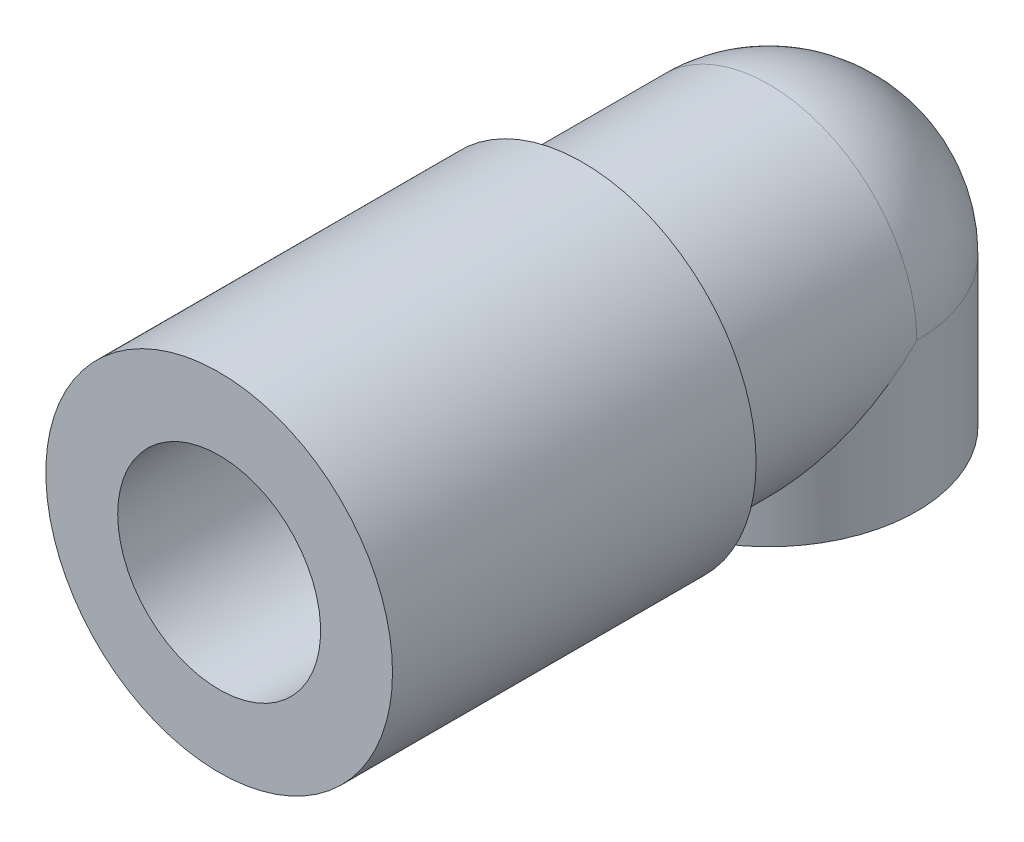
ISO-10303-21;
HEADER;
FILE_DESCRIPTION(('STEP AP214'),'2;1');
FILE_NAME('part.step','',(''),(''),'','','');
FILE_SCHEMA(('AUTOMOTIVE_DESIGN { 1 0 10303 214 1 1 1 1 }'));
ENDSEC;
DATA;
#1=APPLICATION_CONTEXT('core data for automotive mechanical design processes');
#2=APPLICATION_PROTOCOL_DEFINITION('international standard','automotive_design',2000,#1);
#3=PRODUCT_CONTEXT('',#1,'mechanical');
#4=PRODUCT('Part','Part','',(#3));
#5=PRODUCT_RELATED_PRODUCT_CATEGORY('part','',(#4));
#6=PRODUCT_DEFINITION_FORMATION('','',#4);
#7=PRODUCT_DEFINITION_CONTEXT('part definition',#1,'design');
#8=PRODUCT_DEFINITION('design','',#6,#7);
#9=PRODUCT_DEFINITION_SHAPE('','',#8);
#10=(LENGTH_UNIT() NAMED_UNIT(*) SI_UNIT(.MILLI.,.METRE.));
#11=(NAMED_UNIT(*) PLANE_ANGLE_UNIT() SI_UNIT($,.RADIAN.));
#12=(NAMED_UNIT(*) SI_UNIT($,.STERADIAN.) SOLID_ANGLE_UNIT());
#13=UNCERTAINTY_MEASURE_WITH_UNIT(LENGTH_MEASURE(1.E-05),#10,'distance_accuracy_value','');
#14=(GEOMETRIC_REPRESENTATION_CONTEXT(3) GLOBAL_UNCERTAINTY_ASSIGNED_CONTEXT((#13)) GLOBAL_UNIT_ASSIGNED_CONTEXT((#10,
#11,#12)) REPRESENTATION_CONTEXT('',''));
#15=CARTESIAN_POINT('',(0.,0.,0.));
#16=DIRECTION('',(0.,0.,1.));
#17=DIRECTION('',(1.,0.,0.));
#18=AXIS2_PLACEMENT_3D('',#15,#16,#17);
#19=CARTESIAN_POINT('',(0.,0.,0.));
#20=DIRECTION('',(0.,1.,0.));
#21=DIRECTION('',(0.,0.,1.));
#22=AXIS2_PLACEMENT_3D('',#19,#20,#21);
#23=CYLINDRICAL_SURFACE('',#22,3.5);
#24=CARTESIAN_POINT('',(0.,0.,0.));
#25=DIRECTION('',(0.,0.707106781186547,0.707106781186548));
#26=DIRECTION('',(0.,0.707106781186548,-0.707106781186547));
#27=AXIS2_PLACEMENT_3D('',#24,#25,#26);
#28=ELLIPSE('',#27,4.94974746830583,3.5);
#29=CARTESIAN_POINT('',(-3.5,0.,0.));
#30=VERTEX_POINT('',#29);
#31=CARTESIAN_POINT('',(0.,-3.5,3.5));
#32=VERTEX_POINT('',#31);
#33=EDGE_CURVE('E33',#30,#32,#28,.T.);
#34=ORIENTED_EDGE('',*,*,#33,.F.);
#35=CARTESIAN_POINT('',(0.,0.,0.));
#36=DIRECTION('',(0.,1.,0.));
#37=DIRECTION('',(0.,0.,1.));
#38=AXIS2_PLACEMENT_3D('',#35,#36,#37);
#39=CIRCLE('',#38,3.5);
#40=CARTESIAN_POINT('',(3.5,0.,0.));
#41=VERTEX_POINT('',#40);
#42=EDGE_CURVE('E11',#41,#30,#39,.T.);
#43=ORIENTED_EDGE('',*,*,#42,.F.);
#44=EDGE_CURVE('E37',#32,#41,#28,.T.);
#45=ORIENTED_EDGE('',*,*,#44,.F.);
#46=CARTESIAN_POINT('',(0.,-3.5,0.));
#47=DIRECTION('',(0.,1.,0.));
#48=DIRECTION('',(0.,0.,1.));
#49=AXIS2_PLACEMENT_3D('',#46,#47,#48);
#50=CIRCLE('',#49,3.5);
#51=EDGE_CURVE('E26',#32,#32,#50,.T.);
#52=ORIENTED_EDGE('',*,*,#51,.T.);
#53=EDGE_LOOP('',(#34,#43,#45,#52));
#54=FACE_BOUND('',#53,.T.);
#55=ADVANCED_FACE('F17',(#54),#23,.T.);
#56=CARTESIAN_POINT('',(0.,0.,0.));
#57=DIRECTION('',(0.,1.,0.));
#58=DIRECTION('',(0.,0.,-1.));
#59=AXIS2_PLACEMENT_3D('',#56,#57,#58);
#60=SPHERICAL_SURFACE('',#59,3.5);
#61=ORIENTED_EDGE('',*,*,#42,.T.);
#62=CARTESIAN_POINT('',(0.,0.,0.));
#63=DIRECTION('',(0.,0.,1.));
#64=DIRECTION('',(1.,0.,0.));
#65=AXIS2_PLACEMENT_3D('',#62,#63,#64);
#66=CIRCLE('',#65,3.5);
#67=EDGE_CURVE('E42',#41,#30,#66,.T.);
#68=ORIENTED_EDGE('',*,*,#67,.F.);
#69=EDGE_LOOP('',(#61,#68));
#70=FACE_BOUND('',#69,.T.);
#71=ADVANCED_FACE('F19',(#70),#60,.T.);
#72=CARTESIAN_POINT('',(0.,-3.5,0.));
#73=DIRECTION('',(0.,1.,0.));
#74=DIRECTION('',(0.,0.,1.));
#75=AXIS2_PLACEMENT_3D('',#72,#73,#74);
#76=PLANE('',#75);
#77=ORIENTED_EDGE('',*,*,#51,.F.);
#78=EDGE_LOOP('',(#77));
#79=FACE_BOUND('',#78,.T.);
#80=ADVANCED_FACE('F52',(#79),#76,.F.);
#81=CARTESIAN_POINT('',(0.,0.,13.));
#82=DIRECTION('',(0.,0.,1.));
#83=DIRECTION('',(1.,0.,0.));
#84=AXIS2_PLACEMENT_3D('',#81,#82,#83);
#85=CYLINDRICAL_SURFACE('',#84,3.5);
#86=CARTESIAN_POINT('',(0.,0.,4.05358983848622));
#87=DIRECTION('',(0.,0.,1.));
#88=DIRECTION('',(1.,0.,0.));
#89=AXIS2_PLACEMENT_3D('',#86,#87,#88);
#90=CIRCLE('',#89,3.5);
#91=CARTESIAN_POINT('',(3.5,0.,4.05358983848622));
#92=VERTEX_POINT('',#91);
#93=EDGE_CURVE('E44',#92,#92,#90,.T.);
#94=ORIENTED_EDGE('',*,*,#93,.F.);
#95=EDGE_LOOP('',(#94));
#96=FACE_BOUND('',#95,.T.);
#97=ORIENTED_EDGE('',*,*,#67,.T.);
#98=ORIENTED_EDGE('',*,*,#33,.T.);
#99=ORIENTED_EDGE('',*,*,#44,.T.);
#100=EDGE_LOOP('',(#97,#98,#99));
#101=FACE_BOUND('',#100,.T.);
#102=ADVANCED_FACE('F46',(#96,#101),#85,.T.);
#103=CARTESIAN_POINT('',(0.,0.,4.05358983848622));
#104=DIRECTION('',(0.,0.,1.));
#105=DIRECTION('',(1.,0.,0.));
#106=AXIS2_PLACEMENT_3D('',#103,#104,#105);
#107=CONICAL_SURFACE('',#106,3.5,1.04719755119659);
#108=CARTESIAN_POINT('',(0.,0.,4.4));
#109=DIRECTION('',(0.,0.,1.));
#110=DIRECTION('',(1.,0.,0.));
#111=AXIS2_PLACEMENT_3D('',#108,#109,#110);
#112=CIRCLE('',#111,4.1);
#113=CARTESIAN_POINT('',(4.1,0.,4.4));
#114=VERTEX_POINT('',#113);
#115=EDGE_CURVE('E150',#114,#114,#112,.T.);
#116=ORIENTED_EDGE('',*,*,#115,.F.);
#117=EDGE_LOOP('',(#116));
#118=FACE_BOUND('',#117,.T.);
#119=ORIENTED_EDGE('',*,*,#93,.T.);
#120=EDGE_LOOP('',(#119));
#121=FACE_BOUND('',#120,.T.);
#122=ADVANCED_FACE('F61',(#118,#121),#107,.T.);
#123=CARTESIAN_POINT('',(0.,0.,13.));
#124=DIRECTION('',(0.,0.,1.));
#125=DIRECTION('',(1.,0.,0.));
#126=AXIS2_PLACEMENT_3D('',#123,#124,#125);
#127=CYLINDRICAL_SURFACE('',#126,4.1);
#128=CARTESIAN_POINT('',(0.,0.,13.));
#129=DIRECTION('',(0.,0.,1.));
#130=DIRECTION('',(1.,0.,0.));
#131=AXIS2_PLACEMENT_3D('',#128,#129,#130);
#132=CIRCLE('',#131,4.1);
#133=CARTESIAN_POINT('',(4.1,0.,13.));
#134=VERTEX_POINT('',#133);
#135=EDGE_CURVE('E146',#134,#134,#132,.T.);
#136=ORIENTED_EDGE('',*,*,#135,.F.);
#137=EDGE_LOOP('',(#136));
#138=FACE_BOUND('',#137,.T.);
#139=ORIENTED_EDGE('',*,*,#115,.T.);
#140=EDGE_LOOP('',(#139));
#141=FACE_BOUND('',#140,.T.);
#142=ADVANCED_FACE('F95',(#138,#141),#127,.T.);
#143=CARTESIAN_POINT('',(0.,4.1,13.));
#144=DIRECTION('',(0.,0.,-1.));
#145=DIRECTION('',(-1.,0.,0.));
#146=AXIS2_PLACEMENT_3D('',#143,#144,#145);
#147=PLANE('',#146);
#148=CARTESIAN_POINT('',(0.,0.,13.));
#149=DIRECTION('',(0.,0.,-1.));
#150=DIRECTION('',(-1.,0.,0.));
#151=AXIS2_PLACEMENT_3D('',#148,#149,#150);
#152=CIRCLE('',#151,2.4);
#153=CARTESIAN_POINT('',(-2.4,0.,13.));
#154=VERTEX_POINT('',#153);
#155=EDGE_CURVE('E21',#154,#154,#152,.F.);
#156=ORIENTED_EDGE('',*,*,#155,.F.);
#157=EDGE_LOOP('',(#156));
#158=FACE_BOUND('',#157,.T.);
#159=ORIENTED_EDGE('',*,*,#135,.T.);
#160=EDGE_LOOP('',(#159));
#161=FACE_BOUND('',#160,.T.);
#162=ADVANCED_FACE('F105',(#158,#161),#147,.F.);
#163=CARTESIAN_POINT('',(0.,0.,15.4));
#164=DIRECTION('',(0.,0.,-1.));
#165=DIRECTION('',(-1.,0.,0.));
#166=AXIS2_PLACEMENT_3D('',#163,#164,#165);
#167=CYLINDRICAL_SURFACE('',#166,2.4);
#168=CARTESIAN_POINT('',(0.,0.,2.1));
#169=DIRECTION('',(0.,0.,1.));
#170=DIRECTION('',(1.,0.,0.));
#171=AXIS2_PLACEMENT_3D('',#168,#169,#170);
#172=CIRCLE('',#171,2.4);
#173=CARTESIAN_POINT('',(2.4,0.,2.1));
#174=VERTEX_POINT('',#173);
#175=EDGE_CURVE('E143',#174,#174,#172,.T.);
#176=ORIENTED_EDGE('',*,*,#175,.F.);
#177=EDGE_LOOP('',(#176));
#178=FACE_BOUND('',#177,.T.);
#179=ORIENTED_EDGE('',*,*,#155,.T.);
#180=EDGE_LOOP('',(#179));
#181=FACE_BOUND('',#180,.T.);
#182=ADVANCED_FACE('F115',(#178,#181),#167,.F.);
#183=CARTESIAN_POINT('',(0.,0.,2.1));
#184=DIRECTION('',(0.,0.,1.));
#185=DIRECTION('',(1.,0.,0.));
#186=AXIS2_PLACEMENT_3D('',#183,#184,#185);
#187=PLANE('',#186);
#188=ORIENTED_EDGE('',*,*,#175,.T.);
#189=EDGE_LOOP('',(#188));
#190=FACE_BOUND('',#189,.T.);
#191=ADVANCED_FACE('F125',(#190),#187,.T.);
#192=CLOSED_SHELL('',(#55,#71,#80,#102,#122,#142,#162,#182,#191));
#193=MANIFOLD_SOLID_BREP('B1',#192);
#194=ADVANCED_BREP_SHAPE_REPRESENTATION('',(#18,#193),#14);
#195=SHAPE_DEFINITION_REPRESENTATION(#9,#194);
ENDSEC;
END-ISO-10303-21;
